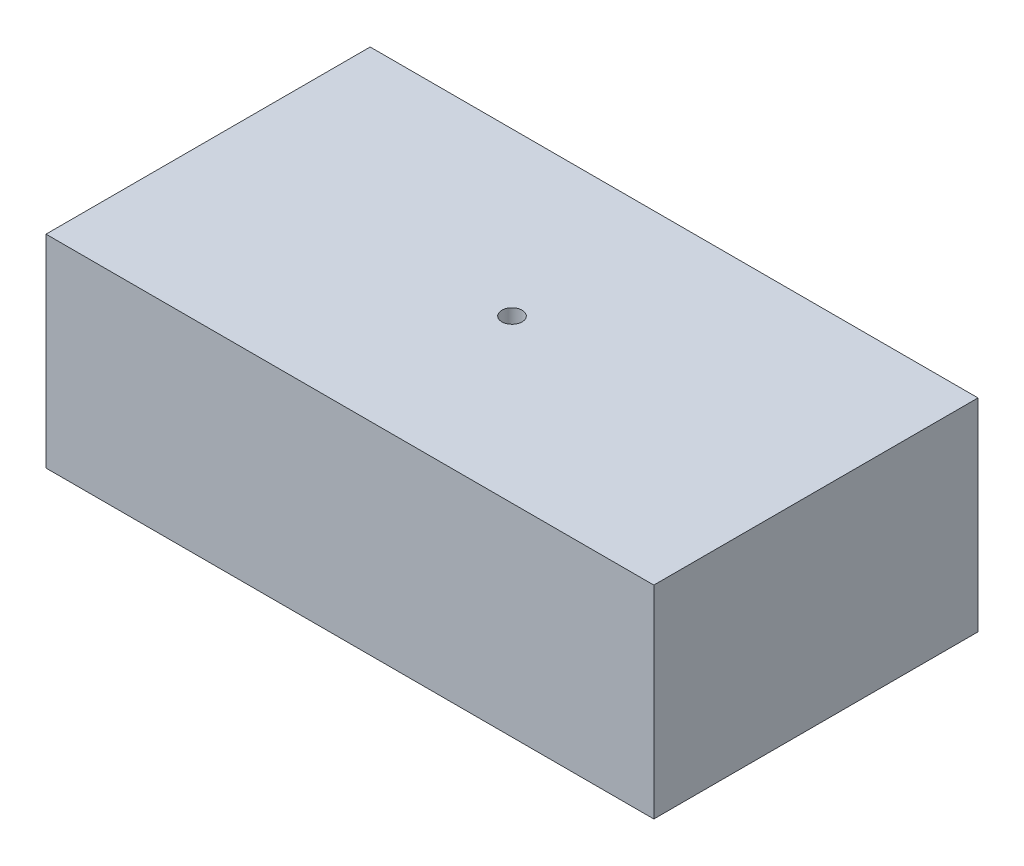
ISO-10303-21;
HEADER;
FILE_DESCRIPTION(('STEP AP214'),'2;1');
FILE_NAME('part.step','',(''),(''),'','','');
FILE_SCHEMA(('AUTOMOTIVE_DESIGN { 1 0 10303 214 1 1 1 1 }'));
ENDSEC;
DATA;
#1=APPLICATION_CONTEXT('core data for automotive mechanical design processes');
#2=APPLICATION_PROTOCOL_DEFINITION('international standard','automotive_design',2000,#1);
#3=PRODUCT_CONTEXT('',#1,'mechanical');
#4=PRODUCT('Part','Part','',(#3));
#5=PRODUCT_RELATED_PRODUCT_CATEGORY('part','',(#4));
#6=PRODUCT_DEFINITION_FORMATION('','',#4);
#7=PRODUCT_DEFINITION_CONTEXT('part definition',#1,'design');
#8=PRODUCT_DEFINITION('design','',#6,#7);
#9=PRODUCT_DEFINITION_SHAPE('','',#8);
#10=(LENGTH_UNIT() NAMED_UNIT(*) SI_UNIT(.MILLI.,.METRE.));
#11=(NAMED_UNIT(*) PLANE_ANGLE_UNIT() SI_UNIT($,.RADIAN.));
#12=(NAMED_UNIT(*) SI_UNIT($,.STERADIAN.) SOLID_ANGLE_UNIT());
#13=UNCERTAINTY_MEASURE_WITH_UNIT(LENGTH_MEASURE(1.E-05),#10,'distance_accuracy_value','');
#14=(GEOMETRIC_REPRESENTATION_CONTEXT(3) GLOBAL_UNCERTAINTY_ASSIGNED_CONTEXT((#13)) GLOBAL_UNIT_ASSIGNED_CONTEXT((#10,
#11,#12)) REPRESENTATION_CONTEXT('',''));
#15=CARTESIAN_POINT('',(0.,0.,0.));
#16=DIRECTION('',(0.,0.,1.));
#17=DIRECTION('',(1.,0.,0.));
#18=AXIS2_PLACEMENT_3D('',#15,#16,#17);
#19=CARTESIAN_POINT('',(0.,0.,0.));
#20=DIRECTION('',(0.,1.,0.));
#21=DIRECTION('',(0.,0.,1.));
#22=AXIS2_PLACEMENT_3D('',#19,#20,#21);
#23=PLANE('',#22);
#24=DIRECTION('',(0.,0.,1.));
#25=VECTOR('',#24,1.);
#26=CARTESIAN_POINT('',(-75.,0.,40.));
#27=LINE('',#26,#25);
#28=CARTESIAN_POINT('',(-75.,0.,-40.));
#29=VERTEX_POINT('',#28);
#30=CARTESIAN_POINT('',(-75.,0.,40.));
#31=VERTEX_POINT('',#30);
#32=EDGE_CURVE('E138',#29,#31,#27,.T.);
#33=ORIENTED_EDGE('',*,*,#32,.F.);
#34=DIRECTION('',(-1.,0.,0.));
#35=VECTOR('',#34,1.);
#36=CARTESIAN_POINT('',(75.,0.,-40.));
#37=LINE('',#36,#35);
#38=CARTESIAN_POINT('',(75.,0.,-40.));
#39=VERTEX_POINT('',#38);
#40=EDGE_CURVE('E86',#39,#29,#37,.T.);
#41=ORIENTED_EDGE('',*,*,#40,.F.);
#42=DIRECTION('',(0.,0.,-1.));
#43=VECTOR('',#42,1.);
#44=CARTESIAN_POINT('',(75.,0.,40.));
#45=LINE('',#44,#43);
#46=CARTESIAN_POINT('',(75.,0.,40.));
#47=VERTEX_POINT('',#46);
#48=EDGE_CURVE('E163',#47,#39,#45,.T.);
#49=ORIENTED_EDGE('',*,*,#48,.F.);
#50=DIRECTION('',(1.,0.,0.));
#51=VECTOR('',#50,1.);
#52=CARTESIAN_POINT('',(75.,0.,40.));
#53=LINE('',#52,#51);
#54=EDGE_CURVE('E144',#31,#47,#53,.T.);
#55=ORIENTED_EDGE('',*,*,#54,.F.);
#56=EDGE_LOOP('',(#33,#41,#49,#55));
#57=FACE_BOUND('',#56,.T.);
#58=DIRECTION('',(0.,0.,1.));
#59=VECTOR('',#58,1.);
#60=CARTESIAN_POINT('',(-72.5,0.,37.5));
#61=LINE('',#60,#59);
#62=CARTESIAN_POINT('',(-72.5,0.,-37.5));
#63=VERTEX_POINT('',#62);
#64=CARTESIAN_POINT('',(-72.5,0.,37.5));
#65=VERTEX_POINT('',#64);
#66=EDGE_CURVE('E56',#63,#65,#61,.T.);
#67=ORIENTED_EDGE('',*,*,#66,.T.);
#68=DIRECTION('',(1.,0.,0.));
#69=VECTOR('',#68,1.);
#70=CARTESIAN_POINT('',(72.5,0.,37.5));
#71=LINE('',#70,#69);
#72=CARTESIAN_POINT('',(72.5,0.,37.5));
#73=VERTEX_POINT('',#72);
#74=EDGE_CURVE('E136',#65,#73,#71,.T.);
#75=ORIENTED_EDGE('',*,*,#74,.T.);
#76=DIRECTION('',(0.,0.,-1.));
#77=VECTOR('',#76,1.);
#78=CARTESIAN_POINT('',(72.5,0.,37.5));
#79=LINE('',#78,#77);
#80=CARTESIAN_POINT('',(72.5,0.,-37.5));
#81=VERTEX_POINT('',#80);
#82=EDGE_CURVE('E243',#73,#81,#79,.T.);
#83=ORIENTED_EDGE('',*,*,#82,.T.);
#84=DIRECTION('',(-1.,0.,0.));
#85=VECTOR('',#84,1.);
#86=CARTESIAN_POINT('',(72.5,0.,-37.5));
#87=LINE('',#86,#85);
#88=EDGE_CURVE('E132',#81,#63,#87,.T.);
#89=ORIENTED_EDGE('',*,*,#88,.T.);
#90=EDGE_LOOP('',(#67,#75,#83,#89));
#91=FACE_BOUND('',#90,.T.);
#92=ADVANCED_FACE('F39',(#57,#91),#23,.F.);
#93=CARTESIAN_POINT('',(-75.,50.,40.));
#94=DIRECTION('',(1.,0.,0.));
#95=DIRECTION('',(0.,0.,-1.));
#96=AXIS2_PLACEMENT_3D('',#93,#94,#95);
#97=PLANE('',#96);
#98=ORIENTED_EDGE('',*,*,#32,.T.);
#99=DIRECTION('',(0.,-1.,0.));
#100=VECTOR('',#99,1.);
#101=CARTESIAN_POINT('',(-75.,50.,40.));
#102=LINE('',#101,#100);
#103=CARTESIAN_POINT('',(-75.,50.,40.));
#104=VERTEX_POINT('',#103);
#105=EDGE_CURVE('E11',#104,#31,#102,.T.);
#106=ORIENTED_EDGE('',*,*,#105,.F.);
#107=DIRECTION('',(0.,0.,1.));
#108=VECTOR('',#107,1.);
#109=CARTESIAN_POINT('',(-75.,50.,40.));
#110=LINE('',#109,#108);
#111=CARTESIAN_POINT('',(-75.,50.,-40.));
#112=VERTEX_POINT('',#111);
#113=EDGE_CURVE('E150',#112,#104,#110,.T.);
#114=ORIENTED_EDGE('',*,*,#113,.F.);
#115=DIRECTION('',(0.,-1.,0.));
#116=VECTOR('',#115,1.);
#117=CARTESIAN_POINT('',(-75.,50.,-40.));
#118=LINE('',#117,#116);
#119=EDGE_CURVE('E159',#112,#29,#118,.T.);
#120=ORIENTED_EDGE('',*,*,#119,.T.);
#121=EDGE_LOOP('',(#98,#106,#114,#120));
#122=FACE_BOUND('',#121,.T.);
#123=ADVANCED_FACE('F41',(#122),#97,.F.);
#124=CARTESIAN_POINT('',(75.,50.,40.));
#125=DIRECTION('',(0.,0.,-1.));
#126=DIRECTION('',(-1.,0.,0.));
#127=AXIS2_PLACEMENT_3D('',#124,#125,#126);
#128=PLANE('',#127);
#129=ORIENTED_EDGE('',*,*,#54,.T.);
#130=DIRECTION('',(0.,-1.,0.));
#131=VECTOR('',#130,1.);
#132=CARTESIAN_POINT('',(75.,50.,40.));
#133=LINE('',#132,#131);
#134=CARTESIAN_POINT('',(75.,50.,40.));
#135=VERTEX_POINT('',#134);
#136=EDGE_CURVE('E49',#135,#47,#133,.T.);
#137=ORIENTED_EDGE('',*,*,#136,.F.);
#138=DIRECTION('',(1.,0.,0.));
#139=VECTOR('',#138,1.);
#140=CARTESIAN_POINT('',(75.,50.,40.));
#141=LINE('',#140,#139);
#142=EDGE_CURVE('E93',#104,#135,#141,.T.);
#143=ORIENTED_EDGE('',*,*,#142,.F.);
#144=ORIENTED_EDGE('',*,*,#105,.T.);
#145=EDGE_LOOP('',(#129,#137,#143,#144));
#146=FACE_BOUND('',#145,.T.);
#147=ADVANCED_FACE('F196',(#146),#128,.F.);
#148=CARTESIAN_POINT('',(75.,50.,40.));
#149=DIRECTION('',(-1.,0.,0.));
#150=DIRECTION('',(0.,0.,1.));
#151=AXIS2_PLACEMENT_3D('',#148,#149,#150);
#152=PLANE('',#151);
#153=ORIENTED_EDGE('',*,*,#48,.T.);
#154=DIRECTION('',(0.,-1.,0.));
#155=VECTOR('',#154,1.);
#156=CARTESIAN_POINT('',(75.,50.,-40.));
#157=LINE('',#156,#155);
#158=CARTESIAN_POINT('',(75.,50.,-40.));
#159=VERTEX_POINT('',#158);
#160=EDGE_CURVE('E170',#159,#39,#157,.T.);
#161=ORIENTED_EDGE('',*,*,#160,.F.);
#162=DIRECTION('',(0.,0.,-1.));
#163=VECTOR('',#162,1.);
#164=CARTESIAN_POINT('',(75.,50.,40.));
#165=LINE('',#164,#163);
#166=EDGE_CURVE('E155',#135,#159,#165,.T.);
#167=ORIENTED_EDGE('',*,*,#166,.F.);
#168=ORIENTED_EDGE('',*,*,#136,.T.);
#169=EDGE_LOOP('',(#153,#161,#167,#168));
#170=FACE_BOUND('',#169,.T.);
#171=ADVANCED_FACE('F178',(#170),#152,.F.);
#172=CARTESIAN_POINT('',(75.,50.,-40.));
#173=DIRECTION('',(0.,0.,1.));
#174=DIRECTION('',(1.,0.,0.));
#175=AXIS2_PLACEMENT_3D('',#172,#173,#174);
#176=PLANE('',#175);
#177=ORIENTED_EDGE('',*,*,#40,.T.);
#178=ORIENTED_EDGE('',*,*,#119,.F.);
#179=DIRECTION('',(-1.,0.,0.));
#180=VECTOR('',#179,1.);
#181=CARTESIAN_POINT('',(75.,50.,-40.));
#182=LINE('',#181,#180);
#183=EDGE_CURVE('E65',#159,#112,#182,.T.);
#184=ORIENTED_EDGE('',*,*,#183,.F.);
#185=ORIENTED_EDGE('',*,*,#160,.T.);
#186=EDGE_LOOP('',(#177,#178,#184,#185));
#187=FACE_BOUND('',#186,.T.);
#188=ADVANCED_FACE('F186',(#187),#176,.F.);
#189=CARTESIAN_POINT('',(0.,50.,0.));
#190=DIRECTION('',(0.,1.,0.));
#191=DIRECTION('',(0.,0.,1.));
#192=AXIS2_PLACEMENT_3D('',#189,#190,#191);
#193=PLANE('',#192);
#194=CARTESIAN_POINT('',(0.,50.,0.));
#195=DIRECTION('',(0.,1.,0.));
#196=DIRECTION('',(0.,0.,1.));
#197=AXIS2_PLACEMENT_3D('',#194,#195,#196);
#198=CIRCLE('',#197,2.5);
#199=CARTESIAN_POINT('',(0.,50.,2.5));
#200=VERTEX_POINT('',#199);
#201=EDGE_CURVE('E227',#200,#200,#198,.T.);
#202=ORIENTED_EDGE('',*,*,#201,.F.);
#203=EDGE_LOOP('',(#202));
#204=FACE_BOUND('',#203,.T.);
#205=ORIENTED_EDGE('',*,*,#113,.T.);
#206=ORIENTED_EDGE('',*,*,#142,.T.);
#207=ORIENTED_EDGE('',*,*,#166,.T.);
#208=ORIENTED_EDGE('',*,*,#183,.T.);
#209=EDGE_LOOP('',(#205,#206,#207,#208));
#210=FACE_BOUND('',#209,.T.);
#211=ADVANCED_FACE('F188',(#204,#210),#193,.T.);
#212=CARTESIAN_POINT('',(-72.5,45.,37.5));
#213=DIRECTION('',(1.,0.,0.));
#214=DIRECTION('',(0.,0.,-1.));
#215=AXIS2_PLACEMENT_3D('',#212,#213,#214);
#216=PLANE('',#215);
#217=ORIENTED_EDGE('',*,*,#66,.F.);
#218=DIRECTION('',(0.,-1.,0.));
#219=VECTOR('',#218,1.);
#220=CARTESIAN_POINT('',(-72.5,45.,-37.5));
#221=LINE('',#220,#219);
#222=CARTESIAN_POINT('',(-72.5,45.,-37.5));
#223=VERTEX_POINT('',#222);
#224=EDGE_CURVE('E130',#223,#63,#221,.T.);
#225=ORIENTED_EDGE('',*,*,#224,.F.);
#226=DIRECTION('',(0.,0.,1.));
#227=VECTOR('',#226,1.);
#228=CARTESIAN_POINT('',(-72.5,45.,37.5));
#229=LINE('',#228,#227);
#230=CARTESIAN_POINT('',(-72.5,45.,37.5));
#231=VERTEX_POINT('',#230);
#232=EDGE_CURVE('E121',#223,#231,#229,.T.);
#233=ORIENTED_EDGE('',*,*,#232,.T.);
#234=DIRECTION('',(0.,-1.,0.));
#235=VECTOR('',#234,1.);
#236=CARTESIAN_POINT('',(-72.5,45.,37.5));
#237=LINE('',#236,#235);
#238=EDGE_CURVE('E129',#231,#65,#237,.T.);
#239=ORIENTED_EDGE('',*,*,#238,.T.);
#240=EDGE_LOOP('',(#217,#225,#233,#239));
#241=FACE_BOUND('',#240,.T.);
#242=ADVANCED_FACE('F128',(#241),#216,.T.);
#243=CARTESIAN_POINT('',(72.5,45.,37.5));
#244=DIRECTION('',(0.,0.,-1.));
#245=DIRECTION('',(-1.,0.,0.));
#246=AXIS2_PLACEMENT_3D('',#243,#244,#245);
#247=PLANE('',#246);
#248=ORIENTED_EDGE('',*,*,#74,.F.);
#249=ORIENTED_EDGE('',*,*,#238,.F.);
#250=DIRECTION('',(1.,0.,0.));
#251=VECTOR('',#250,1.);
#252=CARTESIAN_POINT('',(72.5,45.,37.5));
#253=LINE('',#252,#251);
#254=CARTESIAN_POINT('',(72.5,45.,37.5));
#255=VERTEX_POINT('',#254);
#256=EDGE_CURVE('E117',#231,#255,#253,.T.);
#257=ORIENTED_EDGE('',*,*,#256,.T.);
#258=DIRECTION('',(0.,-1.,0.));
#259=VECTOR('',#258,1.);
#260=CARTESIAN_POINT('',(72.5,45.,37.5));
#261=LINE('',#260,#259);
#262=EDGE_CURVE('E139',#255,#73,#261,.T.);
#263=ORIENTED_EDGE('',*,*,#262,.T.);
#264=EDGE_LOOP('',(#248,#249,#257,#263));
#265=FACE_BOUND('',#264,.T.);
#266=ADVANCED_FACE('F134',(#265),#247,.T.);
#267=CARTESIAN_POINT('',(72.5,45.,37.5));
#268=DIRECTION('',(-1.,0.,0.));
#269=DIRECTION('',(0.,0.,1.));
#270=AXIS2_PLACEMENT_3D('',#267,#268,#269);
#271=PLANE('',#270);
#272=ORIENTED_EDGE('',*,*,#82,.F.);
#273=ORIENTED_EDGE('',*,*,#262,.F.);
#274=DIRECTION('',(0.,0.,-1.));
#275=VECTOR('',#274,1.);
#276=CARTESIAN_POINT('',(72.5,45.,37.5));
#277=LINE('',#276,#275);
#278=CARTESIAN_POINT('',(72.5,45.,-37.5));
#279=VERTEX_POINT('',#278);
#280=EDGE_CURVE('E122',#255,#279,#277,.T.);
#281=ORIENTED_EDGE('',*,*,#280,.T.);
#282=DIRECTION('',(0.,-1.,0.));
#283=VECTOR('',#282,1.);
#284=CARTESIAN_POINT('',(72.5,45.,-37.5));
#285=LINE('',#284,#283);
#286=EDGE_CURVE('E146',#279,#81,#285,.T.);
#287=ORIENTED_EDGE('',*,*,#286,.T.);
#288=EDGE_LOOP('',(#272,#273,#281,#287));
#289=FACE_BOUND('',#288,.T.);
#290=ADVANCED_FACE('F208',(#289),#271,.T.);
#291=CARTESIAN_POINT('',(72.5,45.,-37.5));
#292=DIRECTION('',(0.,0.,1.));
#293=DIRECTION('',(1.,0.,0.));
#294=AXIS2_PLACEMENT_3D('',#291,#292,#293);
#295=PLANE('',#294);
#296=ORIENTED_EDGE('',*,*,#88,.F.);
#297=ORIENTED_EDGE('',*,*,#286,.F.);
#298=DIRECTION('',(-1.,0.,0.));
#299=VECTOR('',#298,1.);
#300=CARTESIAN_POINT('',(72.5,45.,-37.5));
#301=LINE('',#300,#299);
#302=EDGE_CURVE('E238',#279,#223,#301,.T.);
#303=ORIENTED_EDGE('',*,*,#302,.T.);
#304=ORIENTED_EDGE('',*,*,#224,.T.);
#305=EDGE_LOOP('',(#296,#297,#303,#304));
#306=FACE_BOUND('',#305,.T.);
#307=ADVANCED_FACE('F211',(#306),#295,.T.);
#308=CARTESIAN_POINT('',(0.,45.,0.));
#309=DIRECTION('',(0.,1.,0.));
#310=DIRECTION('',(0.,0.,1.));
#311=AXIS2_PLACEMENT_3D('',#308,#309,#310);
#312=PLANE('',#311);
#313=CARTESIAN_POINT('',(0.,45.,0.));
#314=DIRECTION('',(0.,1.,0.));
#315=DIRECTION('',(0.,0.,1.));
#316=AXIS2_PLACEMENT_3D('',#313,#314,#315);
#317=CIRCLE('',#316,2.5);
#318=CARTESIAN_POINT('',(0.,45.,2.5));
#319=VERTEX_POINT('',#318);
#320=EDGE_CURVE('E43',#319,#319,#317,.F.);
#321=ORIENTED_EDGE('',*,*,#320,.F.);
#322=EDGE_LOOP('',(#321));
#323=FACE_BOUND('',#322,.T.);
#324=ORIENTED_EDGE('',*,*,#232,.F.);
#325=ORIENTED_EDGE('',*,*,#302,.F.);
#326=ORIENTED_EDGE('',*,*,#280,.F.);
#327=ORIENTED_EDGE('',*,*,#256,.F.);
#328=EDGE_LOOP('',(#324,#325,#326,#327));
#329=FACE_BOUND('',#328,.T.);
#330=ADVANCED_FACE('F119',(#323,#329),#312,.F.);
#331=CARTESIAN_POINT('',(0.,50.,0.));
#332=DIRECTION('',(0.,-1.,0.));
#333=DIRECTION('',(0.,0.,-1.));
#334=AXIS2_PLACEMENT_3D('',#331,#332,#333);
#335=CYLINDRICAL_SURFACE('',#334,2.5);
#336=ORIENTED_EDGE('',*,*,#201,.T.);
#337=EDGE_LOOP('',(#336));
#338=FACE_BOUND('',#337,.T.);
#339=ORIENTED_EDGE('',*,*,#320,.T.);
#340=EDGE_LOOP('',(#339));
#341=FACE_BOUND('',#340,.T.);
#342=ADVANCED_FACE('F218',(#338,#341),#335,.F.);
#343=CLOSED_SHELL('',(#92,#123,#147,#171,#188,#211,#242,#266,#290,#307,#330,#342));
#344=MANIFOLD_SOLID_BREP('B2',#343);
#345=ADVANCED_BREP_SHAPE_REPRESENTATION('',(#18,#344),#14);
#346=SHAPE_DEFINITION_REPRESENTATION(#9,#345);
ENDSEC;
END-ISO-10303-21;
